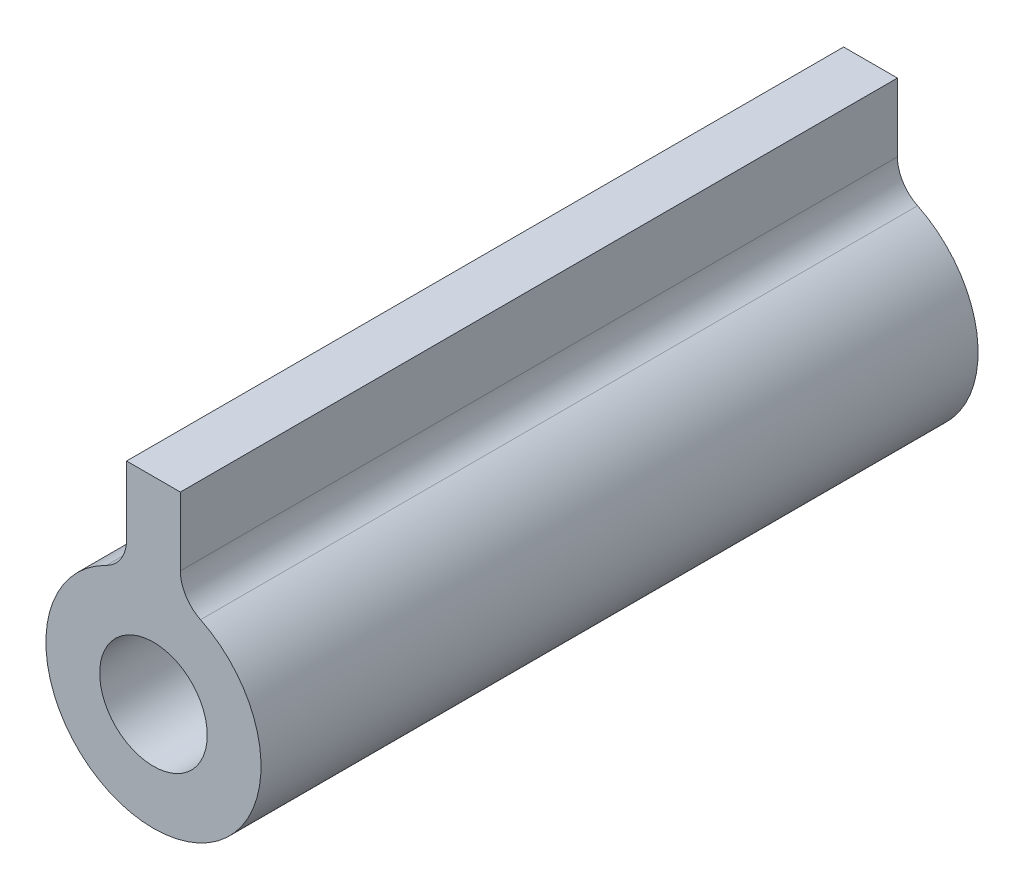
ISO-10303-21;
HEADER;
FILE_DESCRIPTION(('STEP AP214'),'2;1');
FILE_NAME('part.step','',(''),(''),'','','');
FILE_SCHEMA(('AUTOMOTIVE_DESIGN { 1 0 10303 214 1 1 1 1 }'));
ENDSEC;
DATA;
#1=APPLICATION_CONTEXT('core data for automotive mechanical design processes');
#2=APPLICATION_PROTOCOL_DEFINITION('international standard','automotive_design',2000,#1);
#3=PRODUCT_CONTEXT('',#1,'mechanical');
#4=PRODUCT('Part','Part','',(#3));
#5=PRODUCT_RELATED_PRODUCT_CATEGORY('part','',(#4));
#6=PRODUCT_DEFINITION_FORMATION('','',#4);
#7=PRODUCT_DEFINITION_CONTEXT('part definition',#1,'design');
#8=PRODUCT_DEFINITION('design','',#6,#7);
#9=PRODUCT_DEFINITION_SHAPE('','',#8);
#10=(LENGTH_UNIT() NAMED_UNIT(*) SI_UNIT(.MILLI.,.METRE.));
#11=(NAMED_UNIT(*) PLANE_ANGLE_UNIT() SI_UNIT($,.RADIAN.));
#12=(NAMED_UNIT(*) SI_UNIT($,.STERADIAN.) SOLID_ANGLE_UNIT());
#13=UNCERTAINTY_MEASURE_WITH_UNIT(LENGTH_MEASURE(1.E-05),#10,'distance_accuracy_value','');
#14=(GEOMETRIC_REPRESENTATION_CONTEXT(3) GLOBAL_UNCERTAINTY_ASSIGNED_CONTEXT((#13)) GLOBAL_UNIT_ASSIGNED_CONTEXT((#10,
#11,#12)) REPRESENTATION_CONTEXT('',''));
#15=CARTESIAN_POINT('',(0.,0.,0.));
#16=DIRECTION('',(0.,0.,1.));
#17=DIRECTION('',(1.,0.,0.));
#18=AXIS2_PLACEMENT_3D('',#15,#16,#17);
#19=CARTESIAN_POINT('',(0.,0.,40.));
#20=DIRECTION('',(0.,0.,1.));
#21=DIRECTION('',(1.,0.,0.));
#22=AXIS2_PLACEMENT_3D('',#19,#20,#21);
#23=PLANE('',#22);
#24=CARTESIAN_POINT('',(0.,0.,40.));
#25=DIRECTION('',(0.,0.,1.));
#26=DIRECTION('',(1.,0.,0.));
#27=AXIS2_PLACEMENT_3D('',#24,#25,#26);
#28=CIRCLE('',#27,6.);
#29=CARTESIAN_POINT('',(-2.625,5.39531046372681,40.));
#30=VERTEX_POINT('',#29);
#31=CARTESIAN_POINT('',(2.625,5.39531046372681,40.));
#32=VERTEX_POINT('',#31);
#33=EDGE_CURVE('E109',#30,#32,#28,.T.);
#34=ORIENTED_EDGE('',*,*,#33,.T.);
#35=CARTESIAN_POINT('',(3.5,7.19374728496908,40.));
#36=DIRECTION('',(0.,0.,1.));
#37=DIRECTION('',(1.,0.,0.));
#38=AXIS2_PLACEMENT_3D('',#35,#36,#37);
#39=CIRCLE('',#38,2.);
#40=CARTESIAN_POINT('',(1.5,7.19374728496908,40.));
#41=VERTEX_POINT('',#40);
#42=EDGE_CURVE('E11',#32,#41,#39,.F.);
#43=ORIENTED_EDGE('',*,*,#42,.T.);
#44=DIRECTION('',(0.,1.,0.));
#45=VECTOR('',#44,1.);
#46=CARTESIAN_POINT('',(1.5,5.80947501931113,40.));
#47=LINE('',#46,#45);
#48=CARTESIAN_POINT('',(1.5,11.,40.));
#49=VERTEX_POINT('',#48);
#50=EDGE_CURVE('E82',#41,#49,#47,.T.);
#51=ORIENTED_EDGE('',*,*,#50,.T.);
#52=DIRECTION('',(-1.,0.,0.));
#53=VECTOR('',#52,1.);
#54=CARTESIAN_POINT('',(-1.5,11.,40.));
#55=LINE('',#54,#53);
#56=CARTESIAN_POINT('',(-1.5,11.,40.));
#57=VERTEX_POINT('',#56);
#58=EDGE_CURVE('E86',#49,#57,#55,.T.);
#59=ORIENTED_EDGE('',*,*,#58,.T.);
#60=DIRECTION('',(0.,-1.,0.));
#61=VECTOR('',#60,1.);
#62=CARTESIAN_POINT('',(-1.5,5.80947501931113,40.));
#63=LINE('',#62,#61);
#64=CARTESIAN_POINT('',(-1.5,7.19374728496908,40.));
#65=VERTEX_POINT('',#64);
#66=EDGE_CURVE('E99',#57,#65,#63,.T.);
#67=ORIENTED_EDGE('',*,*,#66,.T.);
#68=CARTESIAN_POINT('',(-3.5,7.19374728496908,40.));
#69=DIRECTION('',(0.,0.,1.));
#70=DIRECTION('',(1.,0.,0.));
#71=AXIS2_PLACEMENT_3D('',#68,#69,#70);
#72=CIRCLE('',#71,2.);
#73=EDGE_CURVE('E121',#65,#30,#72,.F.);
#74=ORIENTED_EDGE('',*,*,#73,.T.);
#75=EDGE_LOOP('',(#34,#43,#51,#59,#67,#74));
#76=FACE_BOUND('',#75,.T.);
#77=CARTESIAN_POINT('',(0.,0.,40.));
#78=DIRECTION('',(0.,0.,1.));
#79=DIRECTION('',(1.,0.,0.));
#80=AXIS2_PLACEMENT_3D('',#77,#78,#79);
#81=CIRCLE('',#80,3.);
#82=CARTESIAN_POINT('',(3.,0.,40.));
#83=VERTEX_POINT('',#82);
#84=EDGE_CURVE('E211',#83,#83,#81,.T.);
#85=ORIENTED_EDGE('',*,*,#84,.F.);
#86=EDGE_LOOP('',(#85));
#87=FACE_BOUND('',#86,.T.);
#88=ADVANCED_FACE('F33',(#76,#87),#23,.T.);
#89=CARTESIAN_POINT('',(0.,0.,0.));
#90=DIRECTION('',(0.,0.,1.));
#91=DIRECTION('',(1.,0.,0.));
#92=AXIS2_PLACEMENT_3D('',#89,#90,#91);
#93=PLANE('',#92);
#94=DIRECTION('',(0.,1.,0.));
#95=VECTOR('',#94,1.);
#96=CARTESIAN_POINT('',(1.5,5.80947501931113,0.));
#97=LINE('',#96,#95);
#98=CARTESIAN_POINT('',(1.5,7.19374728496908,0.));
#99=VERTEX_POINT('',#98);
#100=CARTESIAN_POINT('',(1.5,11.,0.));
#101=VERTEX_POINT('',#100);
#102=EDGE_CURVE('E103',#99,#101,#97,.T.);
#103=ORIENTED_EDGE('',*,*,#102,.F.);
#104=CARTESIAN_POINT('',(3.5,7.19374728496908,0.));
#105=DIRECTION('',(0.,0.,1.));
#106=DIRECTION('',(1.,0.,0.));
#107=AXIS2_PLACEMENT_3D('',#104,#105,#106);
#108=CIRCLE('',#107,2.);
#109=CARTESIAN_POINT('',(2.625,5.39531046372681,0.));
#110=VERTEX_POINT('',#109);
#111=EDGE_CURVE('E41',#99,#110,#108,.T.);
#112=ORIENTED_EDGE('',*,*,#111,.T.);
#113=CARTESIAN_POINT('',(0.,0.,0.));
#114=DIRECTION('',(0.,0.,1.));
#115=DIRECTION('',(1.,0.,0.));
#116=AXIS2_PLACEMENT_3D('',#113,#114,#115);
#117=CIRCLE('',#116,6.);
#118=CARTESIAN_POINT('',(-2.625,5.39531046372681,0.));
#119=VERTEX_POINT('',#118);
#120=EDGE_CURVE('E90',#119,#110,#117,.T.);
#121=ORIENTED_EDGE('',*,*,#120,.F.);
#122=CARTESIAN_POINT('',(-3.5,7.19374728496908,0.));
#123=DIRECTION('',(0.,0.,1.));
#124=DIRECTION('',(1.,0.,0.));
#125=AXIS2_PLACEMENT_3D('',#122,#123,#124);
#126=CIRCLE('',#125,2.);
#127=CARTESIAN_POINT('',(-1.5,7.19374728496908,0.));
#128=VERTEX_POINT('',#127);
#129=EDGE_CURVE('E119',#119,#128,#126,.T.);
#130=ORIENTED_EDGE('',*,*,#129,.T.);
#131=DIRECTION('',(0.,-1.,0.));
#132=VECTOR('',#131,1.);
#133=CARTESIAN_POINT('',(-1.5,5.80947501931113,0.));
#134=LINE('',#133,#132);
#135=CARTESIAN_POINT('',(-1.5,11.,0.));
#136=VERTEX_POINT('',#135);
#137=EDGE_CURVE('E131',#136,#128,#134,.T.);
#138=ORIENTED_EDGE('',*,*,#137,.F.);
#139=DIRECTION('',(-1.,0.,0.));
#140=VECTOR('',#139,1.);
#141=CARTESIAN_POINT('',(-1.5,11.,0.));
#142=LINE('',#141,#140);
#143=EDGE_CURVE('E221',#101,#136,#142,.T.);
#144=ORIENTED_EDGE('',*,*,#143,.F.);
#145=EDGE_LOOP('',(#103,#112,#121,#130,#138,#144));
#146=FACE_BOUND('',#145,.T.);
#147=CARTESIAN_POINT('',(0.,0.,0.));
#148=DIRECTION('',(0.,0.,1.));
#149=DIRECTION('',(1.,0.,0.));
#150=AXIS2_PLACEMENT_3D('',#147,#148,#149);
#151=CIRCLE('',#150,3.);
#152=CARTESIAN_POINT('',(3.,0.,0.));
#153=VERTEX_POINT('',#152);
#154=EDGE_CURVE('E214',#153,#153,#151,.T.);
#155=ORIENTED_EDGE('',*,*,#154,.T.);
#156=EDGE_LOOP('',(#155));
#157=FACE_BOUND('',#156,.T.);
#158=ADVANCED_FACE('F125',(#146,#157),#93,.F.);
#159=CARTESIAN_POINT('',(1.5,5.80947501931113,40.));
#160=DIRECTION('',(-1.,0.,0.));
#161=DIRECTION('',(0.,0.,1.));
#162=AXIS2_PLACEMENT_3D('',#159,#160,#161);
#163=PLANE('',#162);
#164=ORIENTED_EDGE('',*,*,#50,.F.);
#165=DIRECTION('',(0.,0.,1.));
#166=VECTOR('',#165,1.);
#167=CARTESIAN_POINT('',(1.5,7.19374728496908,0.));
#168=LINE('',#167,#166);
#169=EDGE_CURVE('E117',#41,#99,#168,.F.);
#170=ORIENTED_EDGE('',*,*,#169,.T.);
#171=ORIENTED_EDGE('',*,*,#102,.T.);
#172=DIRECTION('',(0.,0.,-1.));
#173=VECTOR('',#172,1.);
#174=CARTESIAN_POINT('',(1.5,11.,40.));
#175=LINE('',#174,#173);
#176=EDGE_CURVE('E95',#49,#101,#175,.T.);
#177=ORIENTED_EDGE('',*,*,#176,.F.);
#178=EDGE_LOOP('',(#164,#170,#171,#177));
#179=FACE_BOUND('',#178,.T.);
#180=ADVANCED_FACE('F101',(#179),#163,.F.);
#181=CARTESIAN_POINT('',(-1.5,11.,40.));
#182=DIRECTION('',(0.,-1.,0.));
#183=DIRECTION('',(0.,0.,-1.));
#184=AXIS2_PLACEMENT_3D('',#181,#182,#183);
#185=PLANE('',#184);
#186=ORIENTED_EDGE('',*,*,#143,.T.);
#187=DIRECTION('',(0.,0.,-1.));
#188=VECTOR('',#187,1.);
#189=CARTESIAN_POINT('',(-1.5,11.,40.));
#190=LINE('',#189,#188);
#191=EDGE_CURVE('E97',#57,#136,#190,.T.);
#192=ORIENTED_EDGE('',*,*,#191,.F.);
#193=ORIENTED_EDGE('',*,*,#58,.F.);
#194=ORIENTED_EDGE('',*,*,#176,.T.);
#195=EDGE_LOOP('',(#186,#192,#193,#194));
#196=FACE_BOUND('',#195,.T.);
#197=ADVANCED_FACE('F94',(#196),#185,.F.);
#198=CARTESIAN_POINT('',(-1.5,5.80947501931113,40.));
#199=DIRECTION('',(1.,0.,0.));
#200=DIRECTION('',(0.,0.,-1.));
#201=AXIS2_PLACEMENT_3D('',#198,#199,#200);
#202=PLANE('',#201);
#203=ORIENTED_EDGE('',*,*,#137,.T.);
#204=DIRECTION('',(0.,0.,1.));
#205=VECTOR('',#204,1.);
#206=CARTESIAN_POINT('',(-1.5,7.19374728496908,40.));
#207=LINE('',#206,#205);
#208=EDGE_CURVE('E115',#128,#65,#207,.T.);
#209=ORIENTED_EDGE('',*,*,#208,.T.);
#210=ORIENTED_EDGE('',*,*,#66,.F.);
#211=ORIENTED_EDGE('',*,*,#191,.T.);
#212=EDGE_LOOP('',(#203,#209,#210,#211));
#213=FACE_BOUND('',#212,.T.);
#214=ADVANCED_FACE('F149',(#213),#202,.F.);
#215=CARTESIAN_POINT('',(0.,0.,40.));
#216=DIRECTION('',(0.,0.,-1.));
#217=DIRECTION('',(-1.,0.,0.));
#218=AXIS2_PLACEMENT_3D('',#215,#216,#217);
#219=CYLINDRICAL_SURFACE('',#218,6.);
#220=ORIENTED_EDGE('',*,*,#33,.F.);
#221=DIRECTION('',(0.,0.,-1.));
#222=VECTOR('',#221,1.);
#223=CARTESIAN_POINT('',(-2.625,5.39531046372681,40.));
#224=LINE('',#223,#222);
#225=EDGE_CURVE('E107',#30,#119,#224,.T.);
#226=ORIENTED_EDGE('',*,*,#225,.T.);
#227=ORIENTED_EDGE('',*,*,#120,.T.);
#228=DIRECTION('',(0.,0.,-1.));
#229=VECTOR('',#228,1.);
#230=CARTESIAN_POINT('',(2.625,5.39531046372681,40.));
#231=LINE('',#230,#229);
#232=EDGE_CURVE('E105',#110,#32,#231,.F.);
#233=ORIENTED_EDGE('',*,*,#232,.T.);
#234=EDGE_LOOP('',(#220,#226,#227,#233));
#235=FACE_BOUND('',#234,.T.);
#236=ADVANCED_FACE('F129',(#235),#219,.T.);
#237=CARTESIAN_POINT('',(0.,0.,40.));
#238=DIRECTION('',(0.,0.,-1.));
#239=DIRECTION('',(-1.,0.,0.));
#240=AXIS2_PLACEMENT_3D('',#237,#238,#239);
#241=CYLINDRICAL_SURFACE('',#240,3.);
#242=ORIENTED_EDGE('',*,*,#84,.T.);
#243=EDGE_LOOP('',(#242));
#244=FACE_BOUND('',#243,.T.);
#245=ORIENTED_EDGE('',*,*,#154,.F.);
#246=EDGE_LOOP('',(#245));
#247=FACE_BOUND('',#246,.T.);
#248=ADVANCED_FACE('F137',(#244,#247),#241,.F.);
#249=CARTESIAN_POINT('',(-3.5,7.19374728496908,40.));
#250=DIRECTION('',(0.,0.,-1.));
#251=DIRECTION('',(-1.,0.,0.));
#252=AXIS2_PLACEMENT_3D('',#249,#250,#251);
#253=CYLINDRICAL_SURFACE('',#252,2.);
#254=ORIENTED_EDGE('',*,*,#73,.F.);
#255=ORIENTED_EDGE('',*,*,#208,.F.);
#256=ORIENTED_EDGE('',*,*,#129,.F.);
#257=ORIENTED_EDGE('',*,*,#225,.F.);
#258=EDGE_LOOP('',(#254,#255,#256,#257));
#259=FACE_BOUND('',#258,.T.);
#260=ADVANCED_FACE('F133',(#259),#253,.F.);
#261=CARTESIAN_POINT('',(3.5,7.19374728496908,40.));
#262=DIRECTION('',(0.,0.,-1.));
#263=DIRECTION('',(-1.,0.,0.));
#264=AXIS2_PLACEMENT_3D('',#261,#262,#263);
#265=CYLINDRICAL_SURFACE('',#264,2.);
#266=ORIENTED_EDGE('',*,*,#42,.F.);
#267=ORIENTED_EDGE('',*,*,#232,.F.);
#268=ORIENTED_EDGE('',*,*,#111,.F.);
#269=ORIENTED_EDGE('',*,*,#169,.F.);
#270=EDGE_LOOP('',(#266,#267,#268,#269));
#271=FACE_BOUND('',#270,.T.);
#272=ADVANCED_FACE('F35',(#271),#265,.F.);
#273=CLOSED_SHELL('',(#88,#158,#180,#197,#214,#236,#248,#260,#272));
#274=MANIFOLD_SOLID_BREP('B2',#273);
#275=ADVANCED_BREP_SHAPE_REPRESENTATION('',(#18,#274),#14);
#276=SHAPE_DEFINITION_REPRESENTATION(#9,#275);
ENDSEC;
END-ISO-10303-21;
